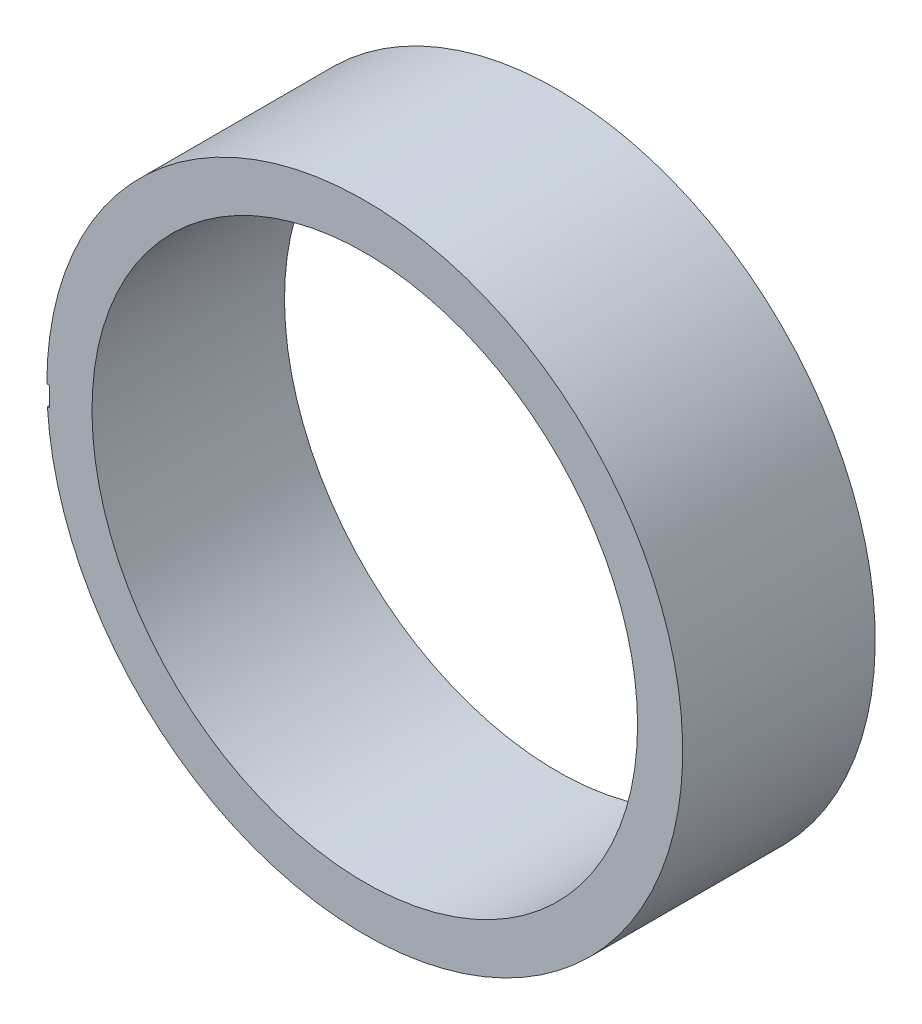
ISO-10303-21;
HEADER;
FILE_DESCRIPTION(('STEP AP214'),'2;1');
FILE_NAME('part.step','',(''),(''),'','','');
FILE_SCHEMA(('AUTOMOTIVE_DESIGN { 1 0 10303 214 1 1 1 1 }'));
ENDSEC;
DATA;
#1=APPLICATION_CONTEXT('core data for automotive mechanical design processes');
#2=APPLICATION_PROTOCOL_DEFINITION('international standard','automotive_design',2000,#1);
#3=PRODUCT_CONTEXT('',#1,'mechanical');
#4=PRODUCT('Part','Part','',(#3));
#5=PRODUCT_RELATED_PRODUCT_CATEGORY('part','',(#4));
#6=PRODUCT_DEFINITION_FORMATION('','',#4);
#7=PRODUCT_DEFINITION_CONTEXT('part definition',#1,'design');
#8=PRODUCT_DEFINITION('design','',#6,#7);
#9=PRODUCT_DEFINITION_SHAPE('','',#8);
#10=(LENGTH_UNIT() NAMED_UNIT(*) SI_UNIT(.MILLI.,.METRE.));
#11=(NAMED_UNIT(*) PLANE_ANGLE_UNIT() SI_UNIT($,.RADIAN.));
#12=(NAMED_UNIT(*) SI_UNIT($,.STERADIAN.) SOLID_ANGLE_UNIT());
#13=UNCERTAINTY_MEASURE_WITH_UNIT(LENGTH_MEASURE(1.E-05),#10,'distance_accuracy_value','');
#14=(GEOMETRIC_REPRESENTATION_CONTEXT(3) GLOBAL_UNCERTAINTY_ASSIGNED_CONTEXT((#13)) GLOBAL_UNIT_ASSIGNED_CONTEXT((#10,
#11,#12)) REPRESENTATION_CONTEXT('',''));
#15=CARTESIAN_POINT('',(0.,0.,0.));
#16=DIRECTION('',(0.,0.,1.));
#17=DIRECTION('',(1.,0.,0.));
#18=AXIS2_PLACEMENT_3D('',#15,#16,#17);
#19=CARTESIAN_POINT('',(0.,0.,0.));
#20=DIRECTION('',(0.,0.,1.));
#21=DIRECTION('',(1.,0.,0.));
#22=AXIS2_PLACEMENT_3D('',#19,#20,#21);
#23=PLANE('',#22);
#24=DIRECTION('',(0.,-1.,0.));
#25=VECTOR('',#24,1.);
#26=CARTESIAN_POINT('',(0.315825751968645,17.6913135961671,0.));
#27=LINE('',#26,#25);
#28=CARTESIAN_POINT('',(0.315825751968645,16.5118651097395,0.));
#29=VERTEX_POINT('',#28);
#30=CARTESIAN_POINT('',(0.315825751968646,14.1664799471991,0.));
#31=VERTEX_POINT('',#30);
#32=EDGE_CURVE('E98',#29,#31,#27,.T.);
#33=ORIENTED_EDGE('',*,*,#32,.T.);
#34=CARTESIAN_POINT('',(0.,0.,0.));
#35=DIRECTION('',(0.,0.,1.));
#36=DIRECTION('',(1.,0.,0.));
#37=AXIS2_PLACEMENT_3D('',#34,#35,#36);
#38=CIRCLE('',#37,14.17);
#39=CARTESIAN_POINT('',(1.63401120248786,14.0754718354357,0.));
#40=VERTEX_POINT('',#39);
#41=EDGE_CURVE('E127',#31,#40,#38,.T.);
#42=ORIENTED_EDGE('',*,*,#41,.T.);
#43=DIRECTION('',(0.,1.,0.));
#44=VECTOR('',#43,1.);
#45=CARTESIAN_POINT('',(1.63401120248786,17.6913135961671,0.));
#46=LINE('',#45,#44);
#47=CARTESIAN_POINT('',(1.63401120248786,16.4338505134367,0.));
#48=VERTEX_POINT('',#47);
#49=EDGE_CURVE('E108',#40,#48,#46,.T.);
#50=ORIENTED_EDGE('',*,*,#49,.T.);
#51=CARTESIAN_POINT('',(0.,0.,0.));
#52=DIRECTION('',(0.,0.,1.));
#53=DIRECTION('',(1.,0.,0.));
#54=AXIS2_PLACEMENT_3D('',#51,#52,#53);
#55=CIRCLE('',#54,16.5148852647495);
#56=CARTESIAN_POINT('',(-16.4845817450077,-1.,0.));
#57=VERTEX_POINT('',#56);
#58=EDGE_CURVE('E121',#57,#48,#55,.T.);
#59=ORIENTED_EDGE('',*,*,#58,.F.);
#60=DIRECTION('',(-1.,0.,0.));
#61=VECTOR('',#60,1.);
#62=CARTESIAN_POINT('',(0.,-1.,0.));
#63=LINE('',#62,#61);
#64=CARTESIAN_POINT('',(-16.3658219913518,-1.,0.));
#65=VERTEX_POINT('',#64);
#66=EDGE_CURVE('E152',#65,#57,#63,.T.);
#67=ORIENTED_EDGE('',*,*,#66,.F.);
#68=DIRECTION('',(0.,1.,0.));
#69=VECTOR('',#68,1.);
#70=CARTESIAN_POINT('',(-16.3658219913518,0.,0.));
#71=LINE('',#70,#69);
#72=CARTESIAN_POINT('',(-16.3658219913518,0.,0.));
#73=VERTEX_POINT('',#72);
#74=EDGE_CURVE('E136',#65,#73,#71,.T.);
#75=ORIENTED_EDGE('',*,*,#74,.T.);
#76=DIRECTION('',(-1.,0.,0.));
#77=VECTOR('',#76,1.);
#78=CARTESIAN_POINT('',(0.,0.,0.));
#79=LINE('',#78,#77);
#80=CARTESIAN_POINT('',(-16.5148852647495,0.,0.));
#81=VERTEX_POINT('',#80);
#82=EDGE_CURVE('E120',#73,#81,#79,.T.);
#83=ORIENTED_EDGE('',*,*,#82,.T.);
#84=EDGE_CURVE('E112',#29,#81,#55,.T.);
#85=ORIENTED_EDGE('',*,*,#84,.F.);
#86=EDGE_LOOP('',(#33,#42,#50,#59,#67,#75,#83,#85));
#87=FACE_BOUND('',#86,.T.);
#88=ADVANCED_FACE('F32',(#87),#23,.F.);
#89=CARTESIAN_POINT('',(0.,0.,10.));
#90=DIRECTION('',(0.,0.,-1.));
#91=DIRECTION('',(-1.,0.,0.));
#92=AXIS2_PLACEMENT_3D('',#89,#90,#91);
#93=CYLINDRICAL_SURFACE('',#92,16.5148852647495);
#94=DIRECTION('',(0.,0.,-1.));
#95=VECTOR('',#94,1.);
#96=CARTESIAN_POINT('',(0.315825751968645,16.5118651097395,10.));
#97=LINE('',#96,#95);
#98=CARTESIAN_POINT('',(0.315825751968645,16.5118651097395,0.00999999999999959));
#99=VERTEX_POINT('',#98);
#100=EDGE_CURVE('E102',#29,#99,#97,.F.);
#101=ORIENTED_EDGE('',*,*,#100,.F.);
#102=ORIENTED_EDGE('',*,*,#84,.T.);
#103=DIRECTION('',(0.,0.,-1.));
#104=VECTOR('',#103,1.);
#105=CARTESIAN_POINT('',(-16.5148852647495,0.,10.));
#106=LINE('',#105,#104);
#107=CARTESIAN_POINT('',(-16.5148852647495,0.,10.));
#108=VERTEX_POINT('',#107);
#109=EDGE_CURVE('E132',#81,#108,#106,.F.);
#110=ORIENTED_EDGE('',*,*,#109,.T.);
#111=CARTESIAN_POINT('',(0.,0.,10.));
#112=DIRECTION('',(0.,0.,1.));
#113=DIRECTION('',(1.,0.,0.));
#114=AXIS2_PLACEMENT_3D('',#111,#112,#113);
#115=CIRCLE('',#114,16.5148852647495);
#116=CARTESIAN_POINT('',(-16.4845817450077,-1.,10.));
#117=VERTEX_POINT('',#116);
#118=EDGE_CURVE('E125',#117,#108,#115,.T.);
#119=ORIENTED_EDGE('',*,*,#118,.F.);
#120=DIRECTION('',(0.,0.,-1.));
#121=VECTOR('',#120,1.);
#122=CARTESIAN_POINT('',(-16.4845817450077,-1.,10.));
#123=LINE('',#122,#121);
#124=EDGE_CURVE('E134',#57,#117,#123,.F.);
#125=ORIENTED_EDGE('',*,*,#124,.F.);
#126=ORIENTED_EDGE('',*,*,#58,.T.);
#127=DIRECTION('',(0.,0.,-1.));
#128=VECTOR('',#127,1.);
#129=CARTESIAN_POINT('',(1.63401120248786,16.4338505134367,10.));
#130=LINE('',#129,#128);
#131=CARTESIAN_POINT('',(1.63401120248786,16.4338505134367,0.00999999999999959));
#132=VERTEX_POINT('',#131);
#133=EDGE_CURVE('E116',#132,#48,#130,.T.);
#134=ORIENTED_EDGE('',*,*,#133,.F.);
#135=CARTESIAN_POINT('',(0.,0.,0.00999999999999959));
#136=DIRECTION('',(0.,0.,1.));
#137=DIRECTION('',(1.,0.,0.));
#138=AXIS2_PLACEMENT_3D('',#135,#136,#137);
#139=CIRCLE('',#138,16.5148852647495);
#140=EDGE_CURVE('E114',#132,#99,#139,.T.);
#141=ORIENTED_EDGE('',*,*,#140,.T.);
#142=EDGE_LOOP('',(#101,#102,#110,#119,#125,#126,#134,#141));
#143=FACE_BOUND('',#142,.T.);
#144=ADVANCED_FACE('F34',(#143),#93,.T.);
#145=CARTESIAN_POINT('',(0.,0.,10.));
#146=DIRECTION('',(0.,0.,-1.));
#147=DIRECTION('',(-1.,0.,0.));
#148=AXIS2_PLACEMENT_3D('',#145,#146,#147);
#149=CYLINDRICAL_SURFACE('',#148,14.17);
#150=CARTESIAN_POINT('',(0.,0.,10.));
#151=DIRECTION('',(0.,0.,1.));
#152=DIRECTION('',(1.,0.,0.));
#153=AXIS2_PLACEMENT_3D('',#150,#151,#152);
#154=CIRCLE('',#153,14.17);
#155=CARTESIAN_POINT('',(14.17,0.,10.));
#156=VERTEX_POINT('',#155);
#157=EDGE_CURVE('E122',#156,#156,#154,.T.);
#158=ORIENTED_EDGE('',*,*,#157,.T.);
#159=EDGE_LOOP('',(#158));
#160=FACE_BOUND('',#159,.T.);
#161=ORIENTED_EDGE('',*,*,#41,.F.);
#162=DIRECTION('',(0.,0.,-1.));
#163=VECTOR('',#162,1.);
#164=CARTESIAN_POINT('',(0.315825751968645,14.1664799471991,10.));
#165=LINE('',#164,#163);
#166=CARTESIAN_POINT('',(0.315825751968646,14.1664799471991,0.00999999999999959));
#167=VERTEX_POINT('',#166);
#168=EDGE_CURVE('E11',#31,#167,#165,.F.);
#169=ORIENTED_EDGE('',*,*,#168,.T.);
#170=CARTESIAN_POINT('',(0.,0.,0.00999999999999959));
#171=DIRECTION('',(0.,0.,1.));
#172=DIRECTION('',(1.,0.,0.));
#173=AXIS2_PLACEMENT_3D('',#170,#171,#172);
#174=CIRCLE('',#173,14.17);
#175=CARTESIAN_POINT('',(1.63401120248786,14.0754718354357,0.00999999999999959));
#176=VERTEX_POINT('',#175);
#177=EDGE_CURVE('E138',#176,#167,#174,.T.);
#178=ORIENTED_EDGE('',*,*,#177,.F.);
#179=DIRECTION('',(0.,0.,-1.));
#180=VECTOR('',#179,1.);
#181=CARTESIAN_POINT('',(1.63401120248786,14.0754718354357,10.));
#182=LINE('',#181,#180);
#183=EDGE_CURVE('E40',#176,#40,#182,.T.);
#184=ORIENTED_EDGE('',*,*,#183,.T.);
#185=EDGE_LOOP('',(#161,#169,#178,#184));
#186=FACE_BOUND('',#185,.T.);
#187=ADVANCED_FACE('F142',(#160,#186),#149,.F.);
#188=CARTESIAN_POINT('',(0.,0.,10.));
#189=DIRECTION('',(0.,0.,1.));
#190=DIRECTION('',(1.,0.,0.));
#191=AXIS2_PLACEMENT_3D('',#188,#189,#190);
#192=PLANE('',#191);
#193=ORIENTED_EDGE('',*,*,#157,.F.);
#194=EDGE_LOOP('',(#193));
#195=FACE_BOUND('',#194,.T.);
#196=DIRECTION('',(0.,1.,0.));
#197=VECTOR('',#196,1.);
#198=CARTESIAN_POINT('',(-16.3658219913518,0.,10.));
#199=LINE('',#198,#197);
#200=CARTESIAN_POINT('',(-16.3658219913518,-1.,10.));
#201=VERTEX_POINT('',#200);
#202=CARTESIAN_POINT('',(-16.3658219913518,0.,10.));
#203=VERTEX_POINT('',#202);
#204=EDGE_CURVE('E146',#201,#203,#199,.T.);
#205=ORIENTED_EDGE('',*,*,#204,.F.);
#206=DIRECTION('',(-1.,0.,0.));
#207=VECTOR('',#206,1.);
#208=CARTESIAN_POINT('',(0.,-1.,10.));
#209=LINE('',#208,#207);
#210=EDGE_CURVE('E147',#201,#117,#209,.T.);
#211=ORIENTED_EDGE('',*,*,#210,.T.);
#212=ORIENTED_EDGE('',*,*,#118,.T.);
#213=DIRECTION('',(-1.,0.,0.));
#214=VECTOR('',#213,1.);
#215=CARTESIAN_POINT('',(0.,0.,10.));
#216=LINE('',#215,#214);
#217=EDGE_CURVE('E55',#203,#108,#216,.T.);
#218=ORIENTED_EDGE('',*,*,#217,.F.);
#219=EDGE_LOOP('',(#205,#211,#212,#218));
#220=FACE_BOUND('',#219,.T.);
#221=ADVANCED_FACE('F178',(#195,#220),#192,.T.);
#222=CARTESIAN_POINT('',(-16.3658219913518,-1.,-1.58032308554353));
#223=DIRECTION('',(1.,0.,0.));
#224=DIRECTION('',(0.,0.,-1.));
#225=AXIS2_PLACEMENT_3D('',#222,#223,#224);
#226=PLANE('',#225);
#227=ORIENTED_EDGE('',*,*,#204,.T.);
#228=DIRECTION('',(0.,0.,-1.));
#229=VECTOR('',#228,1.);
#230=CARTESIAN_POINT('',(-16.3658219913518,0.,-1.58032308554353));
#231=LINE('',#230,#229);
#232=EDGE_CURVE('E115',#203,#73,#231,.T.);
#233=ORIENTED_EDGE('',*,*,#232,.T.);
#234=ORIENTED_EDGE('',*,*,#74,.F.);
#235=DIRECTION('',(0.,0.,-1.));
#236=VECTOR('',#235,1.);
#237=CARTESIAN_POINT('',(-16.3658219913518,-1.,-1.58032308554353));
#238=LINE('',#237,#236);
#239=EDGE_CURVE('E156',#201,#65,#238,.T.);
#240=ORIENTED_EDGE('',*,*,#239,.F.);
#241=EDGE_LOOP('',(#227,#233,#234,#240));
#242=FACE_BOUND('',#241,.T.);
#243=ADVANCED_FACE('F176',(#242),#226,.F.);
#244=CARTESIAN_POINT('',(-18.1140997114962,-1.,12.8429681056478));
#245=DIRECTION('',(0.,1.,0.));
#246=DIRECTION('',(0.,0.,1.));
#247=AXIS2_PLACEMENT_3D('',#244,#245,#246);
#248=PLANE('',#247);
#249=ORIENTED_EDGE('',*,*,#239,.T.);
#250=ORIENTED_EDGE('',*,*,#66,.T.);
#251=ORIENTED_EDGE('',*,*,#124,.T.);
#252=ORIENTED_EDGE('',*,*,#210,.F.);
#253=EDGE_LOOP('',(#249,#250,#251,#252));
#254=FACE_BOUND('',#253,.T.);
#255=ADVANCED_FACE('F172',(#254),#248,.T.);
#256=CARTESIAN_POINT('',(-18.1140997114962,0.,12.8429681056478));
#257=DIRECTION('',(0.,1.,0.));
#258=DIRECTION('',(0.,0.,1.));
#259=AXIS2_PLACEMENT_3D('',#256,#257,#258);
#260=PLANE('',#259);
#261=ORIENTED_EDGE('',*,*,#217,.T.);
#262=ORIENTED_EDGE('',*,*,#109,.F.);
#263=ORIENTED_EDGE('',*,*,#82,.F.);
#264=ORIENTED_EDGE('',*,*,#232,.F.);
#265=EDGE_LOOP('',(#261,#262,#263,#264));
#266=FACE_BOUND('',#265,.T.);
#267=ADVANCED_FACE('F180',(#266),#260,.F.);
#268=CARTESIAN_POINT('',(0.315825751968645,17.6913135961671,0.01));
#269=DIRECTION('',(1.,0.,0.));
#270=DIRECTION('',(0.,1.,0.));
#271=AXIS2_PLACEMENT_3D('',#268,#269,#270);
#272=PLANE('',#271);
#273=ORIENTED_EDGE('',*,*,#100,.T.);
#274=DIRECTION('',(0.,-1.,0.));
#275=VECTOR('',#274,1.);
#276=CARTESIAN_POINT('',(0.315825751968645,17.6913135961671,0.01));
#277=LINE('',#276,#275);
#278=EDGE_CURVE('E163',#99,#167,#277,.T.);
#279=ORIENTED_EDGE('',*,*,#278,.T.);
#280=ORIENTED_EDGE('',*,*,#168,.F.);
#281=ORIENTED_EDGE('',*,*,#32,.F.);
#282=EDGE_LOOP('',(#273,#279,#280,#281));
#283=FACE_BOUND('',#282,.T.);
#284=ADVANCED_FACE('F100',(#283),#272,.T.);
#285=CARTESIAN_POINT('',(1.63401120248786,17.6913135961671,0.01));
#286=DIRECTION('',(-1.,0.,0.));
#287=DIRECTION('',(0.,0.,1.));
#288=AXIS2_PLACEMENT_3D('',#285,#286,#287);
#289=PLANE('',#288);
#290=ORIENTED_EDGE('',*,*,#133,.T.);
#291=ORIENTED_EDGE('',*,*,#49,.F.);
#292=ORIENTED_EDGE('',*,*,#183,.F.);
#293=DIRECTION('',(0.,1.,0.));
#294=VECTOR('',#293,1.);
#295=CARTESIAN_POINT('',(1.63401120248786,17.6913135961671,0.01));
#296=LINE('',#295,#294);
#297=EDGE_CURVE('E47',#176,#132,#296,.T.);
#298=ORIENTED_EDGE('',*,*,#297,.T.);
#299=EDGE_LOOP('',(#290,#291,#292,#298));
#300=FACE_BOUND('',#299,.T.);
#301=ADVANCED_FACE('F167',(#300),#289,.T.);
#302=CARTESIAN_POINT('',(0.315825751968646,12.3493538957259,0.01));
#303=DIRECTION('',(0.,0.,1.));
#304=DIRECTION('',(1.,0.,0.));
#305=AXIS2_PLACEMENT_3D('',#302,#303,#304);
#306=PLANE('',#305);
#307=ORIENTED_EDGE('',*,*,#297,.F.);
#308=ORIENTED_EDGE('',*,*,#177,.T.);
#309=ORIENTED_EDGE('',*,*,#278,.F.);
#310=ORIENTED_EDGE('',*,*,#140,.F.);
#311=EDGE_LOOP('',(#307,#308,#309,#310));
#312=FACE_BOUND('',#311,.T.);
#313=ADVANCED_FACE('F166',(#312),#306,.F.);
#314=CLOSED_SHELL('',(#88,#144,#187,#221,#243,#255,#267,#284,#301,#313));
#315=MANIFOLD_SOLID_BREP('B2',#314);
#316=ADVANCED_BREP_SHAPE_REPRESENTATION('',(#18,#315),#14);
#317=SHAPE_DEFINITION_REPRESENTATION(#9,#316);
ENDSEC;
END-ISO-10303-21;
